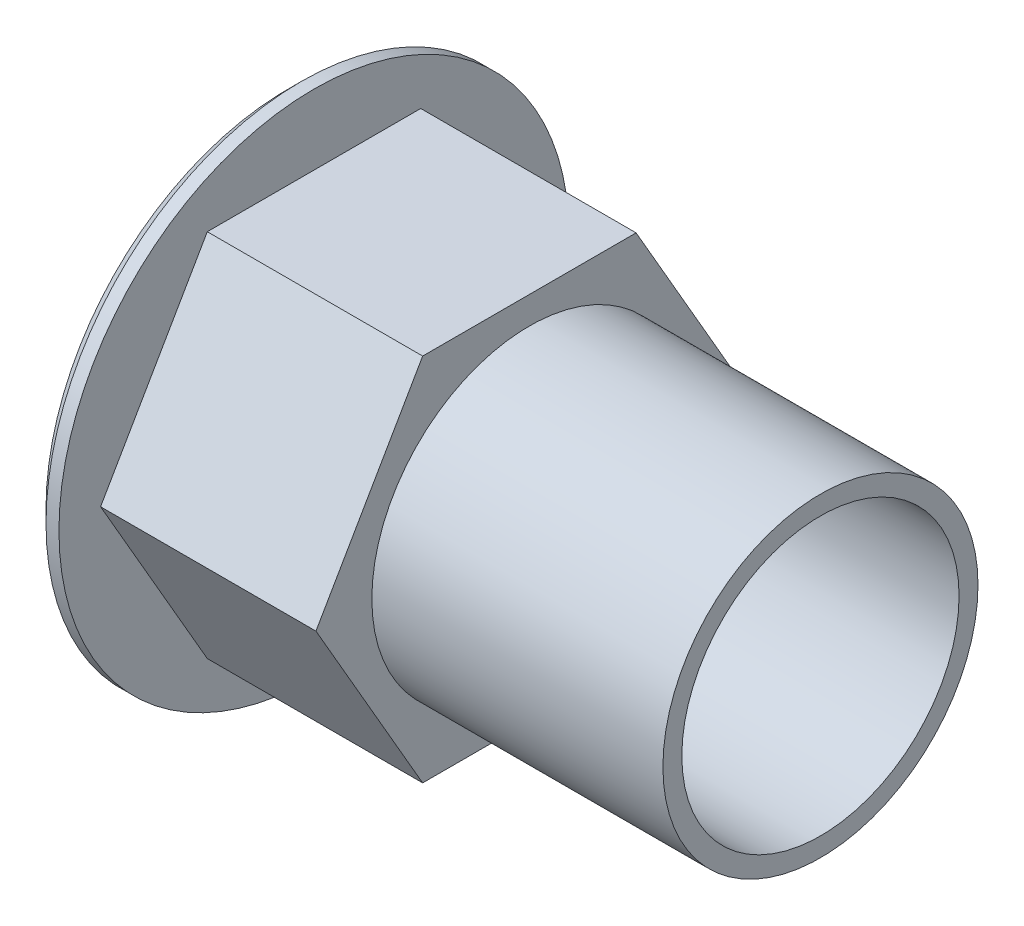
ISO-10303-21;
HEADER;
FILE_DESCRIPTION(('STEP AP214'),'2;1');
FILE_NAME('part.step','',(''),(''),'','','');
FILE_SCHEMA(('AUTOMOTIVE_DESIGN { 1 0 10303 214 1 1 1 1 }'));
ENDSEC;
DATA;
#1=APPLICATION_CONTEXT('core data for automotive mechanical design processes');
#2=APPLICATION_PROTOCOL_DEFINITION('international standard','automotive_design',2000,#1);
#3=PRODUCT_CONTEXT('',#1,'mechanical');
#4=PRODUCT('Part','Part','',(#3));
#5=PRODUCT_RELATED_PRODUCT_CATEGORY('part','',(#4));
#6=PRODUCT_DEFINITION_FORMATION('','',#4);
#7=PRODUCT_DEFINITION_CONTEXT('part definition',#1,'design');
#8=PRODUCT_DEFINITION('design','',#6,#7);
#9=PRODUCT_DEFINITION_SHAPE('','',#8);
#10=(LENGTH_UNIT() NAMED_UNIT(*) SI_UNIT(.MILLI.,.METRE.));
#11=(NAMED_UNIT(*) PLANE_ANGLE_UNIT() SI_UNIT($,.RADIAN.));
#12=(NAMED_UNIT(*) SI_UNIT($,.STERADIAN.) SOLID_ANGLE_UNIT());
#13=UNCERTAINTY_MEASURE_WITH_UNIT(LENGTH_MEASURE(1.E-05),#10,'distance_accuracy_value','');
#14=(GEOMETRIC_REPRESENTATION_CONTEXT(3) GLOBAL_UNCERTAINTY_ASSIGNED_CONTEXT((#13)) GLOBAL_UNIT_ASSIGNED_CONTEXT((#10,
#11,#12)) REPRESENTATION_CONTEXT('',''));
#15=CARTESIAN_POINT('',(0.,0.,0.));
#16=DIRECTION('',(0.,0.,1.));
#17=DIRECTION('',(1.,0.,0.));
#18=AXIS2_PLACEMENT_3D('',#15,#16,#17);
#19=CARTESIAN_POINT('',(0.889,8.763,0.));
#20=DIRECTION('',(-1.,0.,0.));
#21=DIRECTION('',(0.,0.,1.));
#22=AXIS2_PLACEMENT_3D('',#19,#20,#21);
#23=PLANE('',#22);
#24=CARTESIAN_POINT('',(0.889,0.,0.));
#25=DIRECTION('',(-1.,0.,0.));
#26=DIRECTION('',(0.,0.,1.));
#27=AXIS2_PLACEMENT_3D('',#24,#25,#26);
#28=CIRCLE('',#27,8.763);
#29=CARTESIAN_POINT('',(0.889,0.,8.763));
#30=VERTEX_POINT('',#29);
#31=EDGE_CURVE('E165',#30,#30,#28,.T.);
#32=ORIENTED_EDGE('',*,*,#31,.F.);
#33=EDGE_LOOP('',(#32));
#34=FACE_BOUND('',#33,.T.);
#35=DIRECTION('',(0.,0.866025403784439,-0.5));
#36=VECTOR('',#35,1.);
#37=CARTESIAN_POINT('',(0.889,-6.35,-3.66617420935413));
#38=LINE('',#37,#36);
#39=CARTESIAN_POINT('',(0.889,-6.35,-3.66617420935413));
#40=VERTEX_POINT('',#39);
#41=CARTESIAN_POINT('',(0.889,0.,-7.33234841870825));
#42=VERTEX_POINT('',#41);
#43=EDGE_CURVE('E99',#40,#42,#38,.T.);
#44=ORIENTED_EDGE('',*,*,#43,.F.);
#45=DIRECTION('',(0.,0.,-1.));
#46=VECTOR('',#45,1.);
#47=CARTESIAN_POINT('',(0.889,-6.35,3.66617420935412));
#48=LINE('',#47,#46);
#49=CARTESIAN_POINT('',(0.889,-6.35,3.66617420935412));
#50=VERTEX_POINT('',#49);
#51=EDGE_CURVE('E101',#50,#40,#48,.T.);
#52=ORIENTED_EDGE('',*,*,#51,.F.);
#53=DIRECTION('',(0.,-0.866025403784439,-0.5));
#54=VECTOR('',#53,1.);
#55=CARTESIAN_POINT('',(0.889,0.,7.33234841870824));
#56=LINE('',#55,#54);
#57=CARTESIAN_POINT('',(0.889,0.,7.33234841870824));
#58=VERTEX_POINT('',#57);
#59=EDGE_CURVE('E119',#58,#50,#56,.T.);
#60=ORIENTED_EDGE('',*,*,#59,.F.);
#61=DIRECTION('',(0.,-0.866025403784439,0.5));
#62=VECTOR('',#61,1.);
#63=CARTESIAN_POINT('',(0.889,6.35,3.66617420935412));
#64=LINE('',#63,#62);
#65=CARTESIAN_POINT('',(0.889,6.35,3.66617420935412));
#66=VERTEX_POINT('',#65);
#67=EDGE_CURVE('E249',#66,#58,#64,.T.);
#68=ORIENTED_EDGE('',*,*,#67,.F.);
#69=DIRECTION('',(0.,0.,1.));
#70=VECTOR('',#69,1.);
#71=CARTESIAN_POINT('',(0.889,6.35,-3.66617420935412));
#72=LINE('',#71,#70);
#73=CARTESIAN_POINT('',(0.889,6.35,-3.66617420935412));
#74=VERTEX_POINT('',#73);
#75=EDGE_CURVE('E70',#74,#66,#72,.T.);
#76=ORIENTED_EDGE('',*,*,#75,.F.);
#77=DIRECTION('',(0.,0.866025403784439,0.5));
#78=VECTOR('',#77,1.);
#79=CARTESIAN_POINT('',(0.889,0.,-7.33234841870825));
#80=LINE('',#79,#78);
#81=EDGE_CURVE('E65',#42,#74,#80,.T.);
#82=ORIENTED_EDGE('',*,*,#81,.F.);
#83=EDGE_LOOP('',(#44,#52,#60,#68,#76,#82));
#84=FACE_BOUND('',#83,.T.);
#85=ADVANCED_FACE('F49',(#34,#84),#23,.F.);
#86=CARTESIAN_POINT('',(0.,0.,0.));
#87=DIRECTION('',(-1.,0.,0.));
#88=DIRECTION('',(0.,0.,1.));
#89=AXIS2_PLACEMENT_3D('',#86,#87,#88);
#90=CYLINDRICAL_SURFACE('',#89,5.4125);
#91=CARTESIAN_POINT('',(18.288,0.,0.));
#92=DIRECTION('',(-1.,0.,0.));
#93=DIRECTION('',(0.,0.,1.));
#94=AXIS2_PLACEMENT_3D('',#91,#92,#93);
#95=CIRCLE('',#94,5.4125);
#96=CARTESIAN_POINT('',(18.288,0.,5.4125));
#97=VERTEX_POINT('',#96);
#98=EDGE_CURVE('E161',#97,#97,#95,.T.);
#99=ORIENTED_EDGE('',*,*,#98,.T.);
#100=EDGE_LOOP('',(#99));
#101=FACE_BOUND('',#100,.T.);
#102=CARTESIAN_POINT('',(8.288,0.,0.));
#103=DIRECTION('',(-1.,0.,0.));
#104=DIRECTION('',(0.,0.,1.));
#105=AXIS2_PLACEMENT_3D('',#102,#103,#104);
#106=CIRCLE('',#105,5.4125);
#107=CARTESIAN_POINT('',(8.288,0.,5.4125));
#108=VERTEX_POINT('',#107);
#109=EDGE_CURVE('E11',#108,#108,#106,.T.);
#110=ORIENTED_EDGE('',*,*,#109,.F.);
#111=EDGE_LOOP('',(#110));
#112=FACE_BOUND('',#111,.T.);
#113=ADVANCED_FACE('F181',(#101,#112),#90,.T.);
#114=CARTESIAN_POINT('',(0.4445,0.,0.));
#115=DIRECTION('',(1.,0.,0.));
#116=DIRECTION('',(0.,0.,-1.));
#117=AXIS2_PLACEMENT_3D('',#114,#115,#116);
#118=CONICAL_SURFACE('',#117,8.763,0.785398163397447);
#119=CARTESIAN_POINT('',(0.,0.,0.));
#120=DIRECTION('',(-1.,0.,0.));
#121=DIRECTION('',(0.,0.,1.));
#122=AXIS2_PLACEMENT_3D('',#119,#120,#121);
#123=CIRCLE('',#122,8.3185);
#124=CARTESIAN_POINT('',(0.,0.,8.3185));
#125=VERTEX_POINT('',#124);
#126=EDGE_CURVE('E149',#125,#125,#123,.T.);
#127=ORIENTED_EDGE('',*,*,#126,.F.);
#128=EDGE_LOOP('',(#127));
#129=FACE_BOUND('',#128,.T.);
#130=CARTESIAN_POINT('',(0.4445,0.,0.));
#131=DIRECTION('',(-1.,0.,0.));
#132=DIRECTION('',(0.,0.,1.));
#133=AXIS2_PLACEMENT_3D('',#130,#131,#132);
#134=CIRCLE('',#133,8.763);
#135=CARTESIAN_POINT('',(0.4445,0.,8.763));
#136=VERTEX_POINT('',#135);
#137=EDGE_CURVE('E58',#136,#136,#134,.T.);
#138=ORIENTED_EDGE('',*,*,#137,.T.);
#139=EDGE_LOOP('',(#138));
#140=FACE_BOUND('',#139,.T.);
#141=ADVANCED_FACE('F51',(#129,#140),#118,.T.);
#142=CARTESIAN_POINT('',(0.,0.,0.));
#143=DIRECTION('',(-1.,0.,0.));
#144=DIRECTION('',(0.,0.,1.));
#145=AXIS2_PLACEMENT_3D('',#142,#143,#144);
#146=CYLINDRICAL_SURFACE('',#145,8.763);
#147=ORIENTED_EDGE('',*,*,#137,.F.);
#148=EDGE_LOOP('',(#147));
#149=FACE_BOUND('',#148,.T.);
#150=ORIENTED_EDGE('',*,*,#31,.T.);
#151=EDGE_LOOP('',(#150));
#152=FACE_BOUND('',#151,.T.);
#153=ADVANCED_FACE('F174',(#149,#152),#146,.T.);
#154=CARTESIAN_POINT('',(18.288,5.4125,0.));
#155=DIRECTION('',(-1.,0.,0.));
#156=DIRECTION('',(0.,0.,1.));
#157=AXIS2_PLACEMENT_3D('',#154,#155,#156);
#158=PLANE('',#157);
#159=ORIENTED_EDGE('',*,*,#98,.F.);
#160=EDGE_LOOP('',(#159));
#161=FACE_BOUND('',#160,.T.);
#162=CARTESIAN_POINT('',(18.288,0.,0.));
#163=DIRECTION('',(-1.,0.,0.));
#164=DIRECTION('',(0.,0.,1.));
#165=AXIS2_PLACEMENT_3D('',#162,#163,#164);
#166=CIRCLE('',#165,4.7625);
#167=CARTESIAN_POINT('',(18.288,0.,4.7625));
#168=VERTEX_POINT('',#167);
#169=EDGE_CURVE('E157',#168,#168,#166,.T.);
#170=ORIENTED_EDGE('',*,*,#169,.T.);
#171=EDGE_LOOP('',(#170));
#172=FACE_BOUND('',#171,.T.);
#173=ADVANCED_FACE('F177',(#161,#172),#158,.F.);
#174=CARTESIAN_POINT('',(0.,0.,0.));
#175=DIRECTION('',(-1.,0.,0.));
#176=DIRECTION('',(0.,0.,1.));
#177=AXIS2_PLACEMENT_3D('',#174,#175,#176);
#178=CYLINDRICAL_SURFACE('',#177,4.7625);
#179=ORIENTED_EDGE('',*,*,#169,.F.);
#180=EDGE_LOOP('',(#179));
#181=FACE_BOUND('',#180,.T.);
#182=CARTESIAN_POINT('',(0.,0.,0.));
#183=DIRECTION('',(-1.,0.,0.));
#184=DIRECTION('',(0.,0.,1.));
#185=AXIS2_PLACEMENT_3D('',#182,#183,#184);
#186=CIRCLE('',#185,4.7625);
#187=CARTESIAN_POINT('',(0.,0.,4.7625));
#188=VERTEX_POINT('',#187);
#189=EDGE_CURVE('E153',#188,#188,#186,.T.);
#190=ORIENTED_EDGE('',*,*,#189,.T.);
#191=EDGE_LOOP('',(#190));
#192=FACE_BOUND('',#191,.T.);
#193=ADVANCED_FACE('F191',(#181,#192),#178,.F.);
#194=CARTESIAN_POINT('',(0.,4.7625,0.));
#195=DIRECTION('',(1.,0.,0.));
#196=DIRECTION('',(0.,0.,-1.));
#197=AXIS2_PLACEMENT_3D('',#194,#195,#196);
#198=PLANE('',#197);
#199=ORIENTED_EDGE('',*,*,#189,.F.);
#200=EDGE_LOOP('',(#199));
#201=FACE_BOUND('',#200,.T.);
#202=ORIENTED_EDGE('',*,*,#126,.T.);
#203=EDGE_LOOP('',(#202));
#204=FACE_BOUND('',#203,.T.);
#205=ADVANCED_FACE('F195',(#201,#204),#198,.F.);
#206=CARTESIAN_POINT('',(8.288,-6.35,-3.66617420935413));
#207=DIRECTION('',(-1.,0.,0.));
#208=DIRECTION('',(0.,0.,1.));
#209=AXIS2_PLACEMENT_3D('',#206,#207,#208);
#210=PLANE('',#209);
#211=DIRECTION('',(0.,0.866025403784439,-0.5));
#212=VECTOR('',#211,1.);
#213=CARTESIAN_POINT('',(8.288,-6.35,-3.66617420935413));
#214=LINE('',#213,#212);
#215=CARTESIAN_POINT('',(8.288,-6.35,-3.66617420935413));
#216=VERTEX_POINT('',#215);
#217=CARTESIAN_POINT('',(8.288,0.,-7.33234841870825));
#218=VERTEX_POINT('',#217);
#219=EDGE_CURVE('E118',#216,#218,#214,.T.);
#220=ORIENTED_EDGE('',*,*,#219,.T.);
#221=DIRECTION('',(0.,0.866025403784439,0.5));
#222=VECTOR('',#221,1.);
#223=CARTESIAN_POINT('',(8.288,0.,-7.33234841870825));
#224=LINE('',#223,#222);
#225=CARTESIAN_POINT('',(8.288,6.35,-3.66617420935412));
#226=VERTEX_POINT('',#225);
#227=EDGE_CURVE('E228',#218,#226,#224,.T.);
#228=ORIENTED_EDGE('',*,*,#227,.T.);
#229=DIRECTION('',(0.,0.,1.));
#230=VECTOR('',#229,1.);
#231=CARTESIAN_POINT('',(8.288,6.35,-3.66617420935412));
#232=LINE('',#231,#230);
#233=CARTESIAN_POINT('',(8.288,6.35,3.66617420935412));
#234=VERTEX_POINT('',#233);
#235=EDGE_CURVE('E234',#226,#234,#232,.T.);
#236=ORIENTED_EDGE('',*,*,#235,.T.);
#237=DIRECTION('',(0.,-0.866025403784439,0.5));
#238=VECTOR('',#237,1.);
#239=CARTESIAN_POINT('',(8.288,6.35,3.66617420935412));
#240=LINE('',#239,#238);
#241=CARTESIAN_POINT('',(8.288,0.,7.33234841870824));
#242=VERTEX_POINT('',#241);
#243=EDGE_CURVE('E238',#234,#242,#240,.T.);
#244=ORIENTED_EDGE('',*,*,#243,.T.);
#245=DIRECTION('',(0.,-0.866025403784439,-0.5));
#246=VECTOR('',#245,1.);
#247=CARTESIAN_POINT('',(8.288,0.,7.33234841870824));
#248=LINE('',#247,#246);
#249=CARTESIAN_POINT('',(8.288,-6.35,3.66617420935412));
#250=VERTEX_POINT('',#249);
#251=EDGE_CURVE('E131',#242,#250,#248,.T.);
#252=ORIENTED_EDGE('',*,*,#251,.T.);
#253=DIRECTION('',(0.,0.,-1.));
#254=VECTOR('',#253,1.);
#255=CARTESIAN_POINT('',(8.288,-6.35,3.66617420935412));
#256=LINE('',#255,#254);
#257=EDGE_CURVE('E124',#250,#216,#256,.T.);
#258=ORIENTED_EDGE('',*,*,#257,.T.);
#259=EDGE_LOOP('',(#220,#228,#236,#244,#252,#258));
#260=FACE_BOUND('',#259,.T.);
#261=ORIENTED_EDGE('',*,*,#109,.T.);
#262=EDGE_LOOP('',(#261));
#263=FACE_BOUND('',#262,.T.);
#264=ADVANCED_FACE('F199',(#260,#263),#210,.F.);
#265=CARTESIAN_POINT('',(8.288,-6.35,-3.66617420935413));
#266=DIRECTION('',(0.,0.5,0.866025403784439));
#267=DIRECTION('',(0.,-0.866025403784439,0.5));
#268=AXIS2_PLACEMENT_3D('',#265,#266,#267);
#269=PLANE('',#268);
#270=ORIENTED_EDGE('',*,*,#43,.T.);
#271=DIRECTION('',(-1.,0.,0.));
#272=VECTOR('',#271,1.);
#273=CARTESIAN_POINT('',(8.288,0.,-7.33234841870825));
#274=LINE('',#273,#272);
#275=EDGE_CURVE('E146',#218,#42,#274,.T.);
#276=ORIENTED_EDGE('',*,*,#275,.F.);
#277=ORIENTED_EDGE('',*,*,#219,.F.);
#278=DIRECTION('',(-1.,0.,0.));
#279=VECTOR('',#278,1.);
#280=CARTESIAN_POINT('',(8.288,-6.35,-3.66617420935413));
#281=LINE('',#280,#279);
#282=EDGE_CURVE('E113',#216,#40,#281,.T.);
#283=ORIENTED_EDGE('',*,*,#282,.T.);
#284=EDGE_LOOP('',(#270,#276,#277,#283));
#285=FACE_BOUND('',#284,.T.);
#286=ADVANCED_FACE('F121',(#285),#269,.F.);
#287=CARTESIAN_POINT('',(8.288,0.,-7.33234841870825));
#288=DIRECTION('',(0.,-0.5,0.866025403784438));
#289=DIRECTION('',(0.,-0.866025403784439,-0.5));
#290=AXIS2_PLACEMENT_3D('',#287,#288,#289);
#291=PLANE('',#290);
#292=ORIENTED_EDGE('',*,*,#81,.T.);
#293=DIRECTION('',(-1.,0.,0.));
#294=VECTOR('',#293,1.);
#295=CARTESIAN_POINT('',(8.288,6.35,-3.66617420935412));
#296=LINE('',#295,#294);
#297=EDGE_CURVE('E142',#226,#74,#296,.T.);
#298=ORIENTED_EDGE('',*,*,#297,.F.);
#299=ORIENTED_EDGE('',*,*,#227,.F.);
#300=ORIENTED_EDGE('',*,*,#275,.T.);
#301=EDGE_LOOP('',(#292,#298,#299,#300));
#302=FACE_BOUND('',#301,.T.);
#303=ADVANCED_FACE('F203',(#302),#291,.F.);
#304=CARTESIAN_POINT('',(8.288,6.35,-3.66617420935412));
#305=DIRECTION('',(0.,-1.,0.));
#306=DIRECTION('',(0.,0.,-1.));
#307=AXIS2_PLACEMENT_3D('',#304,#305,#306);
#308=PLANE('',#307);
#309=ORIENTED_EDGE('',*,*,#75,.T.);
#310=DIRECTION('',(-1.,0.,0.));
#311=VECTOR('',#310,1.);
#312=CARTESIAN_POINT('',(8.288,6.35,3.66617420935412));
#313=LINE('',#312,#311);
#314=EDGE_CURVE('E138',#234,#66,#313,.T.);
#315=ORIENTED_EDGE('',*,*,#314,.F.);
#316=ORIENTED_EDGE('',*,*,#235,.F.);
#317=ORIENTED_EDGE('',*,*,#297,.T.);
#318=EDGE_LOOP('',(#309,#315,#316,#317));
#319=FACE_BOUND('',#318,.T.);
#320=ADVANCED_FACE('F206',(#319),#308,.F.);
#321=CARTESIAN_POINT('',(8.288,6.35,3.66617420935412));
#322=DIRECTION('',(0.,-0.5,-0.866025403784439));
#323=DIRECTION('',(0.,0.866025403784439,-0.5));
#324=AXIS2_PLACEMENT_3D('',#321,#322,#323);
#325=PLANE('',#324);
#326=ORIENTED_EDGE('',*,*,#67,.T.);
#327=DIRECTION('',(-1.,0.,0.));
#328=VECTOR('',#327,1.);
#329=CARTESIAN_POINT('',(8.288,0.,7.33234841870824));
#330=LINE('',#329,#328);
#331=EDGE_CURVE('E129',#242,#58,#330,.T.);
#332=ORIENTED_EDGE('',*,*,#331,.F.);
#333=ORIENTED_EDGE('',*,*,#243,.F.);
#334=ORIENTED_EDGE('',*,*,#314,.T.);
#335=EDGE_LOOP('',(#326,#332,#333,#334));
#336=FACE_BOUND('',#335,.T.);
#337=ADVANCED_FACE('F210',(#336),#325,.F.);
#338=CARTESIAN_POINT('',(8.288,0.,7.33234841870824));
#339=DIRECTION('',(0.,0.5,-0.866025403784439));
#340=DIRECTION('',(0.,0.866025403784439,0.5));
#341=AXIS2_PLACEMENT_3D('',#338,#339,#340);
#342=PLANE('',#341);
#343=ORIENTED_EDGE('',*,*,#59,.T.);
#344=DIRECTION('',(-1.,0.,0.));
#345=VECTOR('',#344,1.);
#346=CARTESIAN_POINT('',(8.288,-6.35,3.66617420935412));
#347=LINE('',#346,#345);
#348=EDGE_CURVE('E116',#250,#50,#347,.T.);
#349=ORIENTED_EDGE('',*,*,#348,.F.);
#350=ORIENTED_EDGE('',*,*,#251,.F.);
#351=ORIENTED_EDGE('',*,*,#331,.T.);
#352=EDGE_LOOP('',(#343,#349,#350,#351));
#353=FACE_BOUND('',#352,.T.);
#354=ADVANCED_FACE('F214',(#353),#342,.F.);
#355=CARTESIAN_POINT('',(8.288,-6.35,3.66617420935412));
#356=DIRECTION('',(0.,1.,0.));
#357=DIRECTION('',(0.,0.,1.));
#358=AXIS2_PLACEMENT_3D('',#355,#356,#357);
#359=PLANE('',#358);
#360=ORIENTED_EDGE('',*,*,#51,.T.);
#361=ORIENTED_EDGE('',*,*,#282,.F.);
#362=ORIENTED_EDGE('',*,*,#257,.F.);
#363=ORIENTED_EDGE('',*,*,#348,.T.);
#364=EDGE_LOOP('',(#360,#361,#362,#363));
#365=FACE_BOUND('',#364,.T.);
#366=ADVANCED_FACE('F111',(#365),#359,.F.);
#367=CLOSED_SHELL('',(#85,#113,#141,#153,#173,#193,#205,#264,#286,#303,#320,#337,#354,#366));
#368=MANIFOLD_SOLID_BREP('B2',#367);
#369=ADVANCED_BREP_SHAPE_REPRESENTATION('',(#18,#368),#14);
#370=SHAPE_DEFINITION_REPRESENTATION(#9,#369);
ENDSEC;
END-ISO-10303-21;
